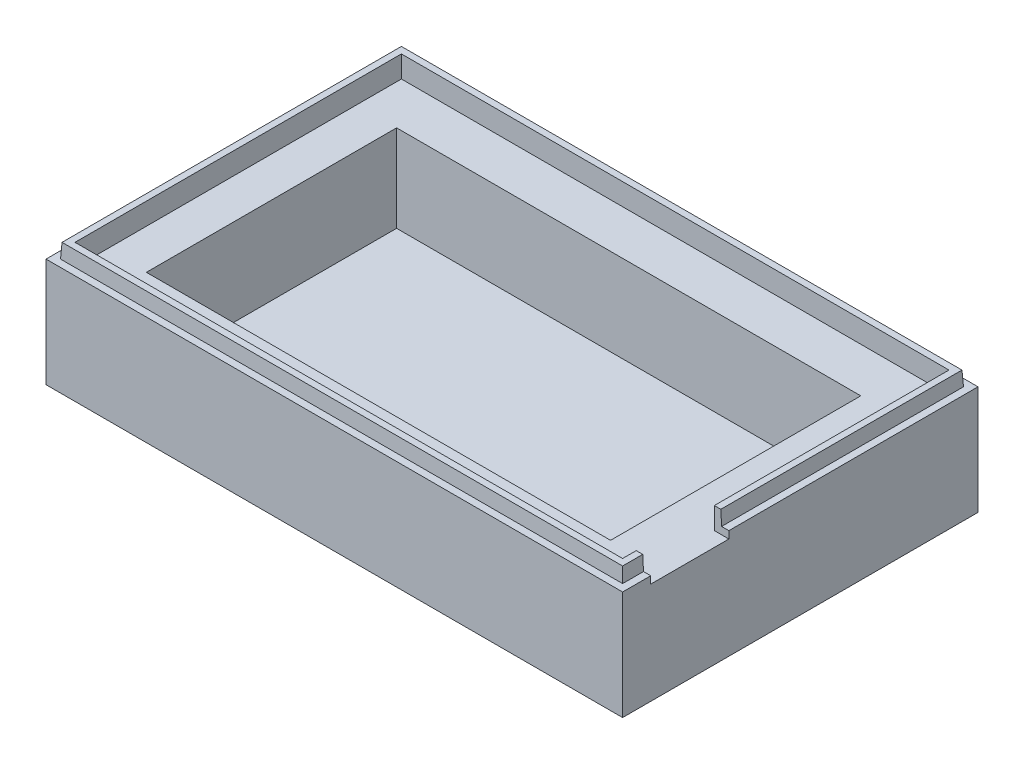
ISO-10303-21;
HEADER;
FILE_DESCRIPTION(('STEP AP214'),'2;1');
FILE_NAME('part.step','',(''),(''),'','','');
FILE_SCHEMA(('AUTOMOTIVE_DESIGN { 1 0 10303 214 1 1 1 1 }'));
ENDSEC;
DATA;
#1=APPLICATION_CONTEXT('core data for automotive mechanical design processes');
#2=APPLICATION_PROTOCOL_DEFINITION('international standard','automotive_design',2000,#1);
#3=PRODUCT_CONTEXT('',#1,'mechanical');
#4=PRODUCT('Part','Part','',(#3));
#5=PRODUCT_RELATED_PRODUCT_CATEGORY('part','',(#4));
#6=PRODUCT_DEFINITION_FORMATION('','',#4);
#7=PRODUCT_DEFINITION_CONTEXT('part definition',#1,'design');
#8=PRODUCT_DEFINITION('design','',#6,#7);
#9=PRODUCT_DEFINITION_SHAPE('','',#8);
#10=(LENGTH_UNIT() NAMED_UNIT(*) SI_UNIT(.MILLI.,.METRE.));
#11=(NAMED_UNIT(*) PLANE_ANGLE_UNIT() SI_UNIT($,.RADIAN.));
#12=(NAMED_UNIT(*) SI_UNIT($,.STERADIAN.) SOLID_ANGLE_UNIT());
#13=UNCERTAINTY_MEASURE_WITH_UNIT(LENGTH_MEASURE(1.E-05),#10,'distance_accuracy_value','');
#14=(GEOMETRIC_REPRESENTATION_CONTEXT(3) GLOBAL_UNCERTAINTY_ASSIGNED_CONTEXT((#13)) GLOBAL_UNIT_ASSIGNED_CONTEXT((#10,
#11,#12)) REPRESENTATION_CONTEXT('',''));
#15=CARTESIAN_POINT('',(0.,0.,0.));
#16=DIRECTION('',(0.,0.,1.));
#17=DIRECTION('',(1.,0.,0.));
#18=AXIS2_PLACEMENT_3D('',#15,#16,#17);
#19=CARTESIAN_POINT('',(0.,15.,0.));
#20=DIRECTION('',(0.,-1.,0.));
#21=DIRECTION('',(0.,0.,-1.));
#22=AXIS2_PLACEMENT_3D('',#19,#20,#21);
#23=PLANE('',#22);
#24=DIRECTION('',(0.,0.,-1.));
#25=VECTOR('',#24,1.);
#26=CARTESIAN_POINT('',(78.5,15.,0.));
#27=LINE('',#26,#25);
#28=CARTESIAN_POINT('',(78.5,15.,-14.65));
#29=VERTEX_POINT('',#28);
#30=CARTESIAN_POINT('',(78.5,15.,-48.));
#31=VERTEX_POINT('',#30);
#32=EDGE_CURVE('E322',#29,#31,#27,.T.);
#33=ORIENTED_EDGE('',*,*,#32,.F.);
#34=DIRECTION('',(1.,0.,0.));
#35=VECTOR('',#34,1.);
#36=CARTESIAN_POINT('',(-0.00100000000002876,15.,-14.65));
#37=LINE('',#36,#35);
#38=CARTESIAN_POINT('',(79.5,15.,-14.65));
#39=VERTEX_POINT('',#38);
#40=EDGE_CURVE('E380',#29,#39,#37,.T.);
#41=ORIENTED_EDGE('',*,*,#40,.T.);
#42=DIRECTION('',(0.,0.,-1.));
#43=VECTOR('',#42,1.);
#44=CARTESIAN_POINT('',(79.5,15.,0.));
#45=LINE('',#44,#43);
#46=CARTESIAN_POINT('',(79.5,15.,-49.));
#47=VERTEX_POINT('',#46);
#48=EDGE_CURVE('E423',#39,#47,#45,.T.);
#49=ORIENTED_EDGE('',*,*,#48,.T.);
#50=DIRECTION('',(-1.,0.,0.));
#51=VECTOR('',#50,1.);
#52=CARTESIAN_POINT('',(0.,15.,-49.));
#53=LINE('',#52,#51);
#54=CARTESIAN_POINT('',(0.,15.,-49.));
#55=VERTEX_POINT('',#54);
#56=EDGE_CURVE('E393',#47,#55,#53,.T.);
#57=ORIENTED_EDGE('',*,*,#56,.T.);
#58=DIRECTION('',(0.,0.,1.));
#59=VECTOR('',#58,1.);
#60=CARTESIAN_POINT('',(0.,15.,0.));
#61=LINE('',#60,#59);
#62=CARTESIAN_POINT('',(0.,15.,0.));
#63=VERTEX_POINT('',#62);
#64=EDGE_CURVE('E396',#55,#63,#61,.T.);
#65=ORIENTED_EDGE('',*,*,#64,.T.);
#66=DIRECTION('',(1.,0.,0.));
#67=VECTOR('',#66,1.);
#68=CARTESIAN_POINT('',(0.,15.,0.));
#69=LINE('',#68,#67);
#70=CARTESIAN_POINT('',(79.5,15.,0.));
#71=VERTEX_POINT('',#70);
#72=EDGE_CURVE('E419',#63,#71,#69,.T.);
#73=ORIENTED_EDGE('',*,*,#72,.T.);
#74=CARTESIAN_POINT('',(79.5,15.,-3.87999999999998));
#75=VERTEX_POINT('',#74);
#76=EDGE_CURVE('E407',#71,#75,#45,.T.);
#77=ORIENTED_EDGE('',*,*,#76,.T.);
#78=DIRECTION('',(1.,0.,0.));
#79=VECTOR('',#78,1.);
#80=CARTESIAN_POINT('',(-0.00100000000001488,15.,-3.87999999999993));
#81=LINE('',#80,#79);
#82=CARTESIAN_POINT('',(78.5,15.,-3.87999999999998));
#83=VERTEX_POINT('',#82);
#84=EDGE_CURVE('E377',#83,#75,#81,.T.);
#85=ORIENTED_EDGE('',*,*,#84,.F.);
#86=DIRECTION('',(0.,0.,-1.));
#87=VECTOR('',#86,1.);
#88=CARTESIAN_POINT('',(78.5,15.,0.));
#89=LINE('',#88,#87);
#90=CARTESIAN_POINT('',(78.5,15.,-1.));
#91=VERTEX_POINT('',#90);
#92=EDGE_CURVE('E297',#91,#83,#89,.T.);
#93=ORIENTED_EDGE('',*,*,#92,.F.);
#94=DIRECTION('',(1.,0.,0.));
#95=VECTOR('',#94,1.);
#96=CARTESIAN_POINT('',(0.,15.,-1.));
#97=LINE('',#96,#95);
#98=CARTESIAN_POINT('',(0.999999999999977,15.,-1.));
#99=VERTEX_POINT('',#98);
#100=EDGE_CURVE('E301',#99,#91,#97,.T.);
#101=ORIENTED_EDGE('',*,*,#100,.F.);
#102=DIRECTION('',(0.,0.,1.));
#103=VECTOR('',#102,1.);
#104=CARTESIAN_POINT('',(0.999999999999977,15.,0.));
#105=LINE('',#104,#103);
#106=CARTESIAN_POINT('',(0.999999999999972,15.,-48.));
#107=VERTEX_POINT('',#106);
#108=EDGE_CURVE('E143',#107,#99,#105,.T.);
#109=ORIENTED_EDGE('',*,*,#108,.F.);
#110=DIRECTION('',(-1.,0.,0.));
#111=VECTOR('',#110,1.);
#112=CARTESIAN_POINT('',(0.,15.,-48.));
#113=LINE('',#112,#111);
#114=EDGE_CURVE('E138',#31,#107,#113,.T.);
#115=ORIENTED_EDGE('',*,*,#114,.F.);
#116=EDGE_LOOP('',(#33,#41,#49,#57,#65,#73,#77,#85,#93,#101,#109,#115));
#117=FACE_BOUND('',#116,.T.);
#118=ADVANCED_FACE('F121',(#117),#23,.F.);
#119=CARTESIAN_POINT('',(77.5,14.,-47.));
#120=DIRECTION('',(1.,0.,0.));
#121=DIRECTION('',(0.,0.,-1.));
#122=AXIS2_PLACEMENT_3D('',#119,#120,#121);
#123=PLANE('',#122);
#124=DIRECTION('',(0.,0.,-1.));
#125=VECTOR('',#124,1.);
#126=CARTESIAN_POINT('',(77.5,14.,-47.));
#127=LINE('',#126,#125);
#128=CARTESIAN_POINT('',(77.5,14.,-14.65));
#129=VERTEX_POINT('',#128);
#130=CARTESIAN_POINT('',(77.5,14.,-47.));
#131=VERTEX_POINT('',#130);
#132=EDGE_CURVE('E276',#129,#131,#127,.T.);
#133=ORIENTED_EDGE('',*,*,#132,.F.);
#134=DIRECTION('',(0.,-1.,0.));
#135=VECTOR('',#134,1.);
#136=CARTESIAN_POINT('',(77.5,15.,-14.65));
#137=LINE('',#136,#135);
#138=CARTESIAN_POINT('',(77.5,17.,-14.65));
#139=VERTEX_POINT('',#138);
#140=EDGE_CURVE('E270',#139,#129,#137,.T.);
#141=ORIENTED_EDGE('',*,*,#140,.F.);
#142=DIRECTION('',(0.,0.,-1.));
#143=VECTOR('',#142,1.);
#144=CARTESIAN_POINT('',(77.5,17.,-47.));
#145=LINE('',#144,#143);
#146=CARTESIAN_POINT('',(77.5,17.,-47.));
#147=VERTEX_POINT('',#146);
#148=EDGE_CURVE('E275',#139,#147,#145,.T.);
#149=ORIENTED_EDGE('',*,*,#148,.T.);
#150=DIRECTION('',(0.,1.,0.));
#151=VECTOR('',#150,1.);
#152=CARTESIAN_POINT('',(77.5,14.,-47.));
#153=LINE('',#152,#151);
#154=EDGE_CURVE('E515',#131,#147,#153,.T.);
#155=ORIENTED_EDGE('',*,*,#154,.F.);
#156=EDGE_LOOP('',(#133,#141,#149,#155));
#157=FACE_BOUND('',#156,.T.);
#158=ADVANCED_FACE('F272',(#157),#123,.F.);
#159=CARTESIAN_POINT('',(0.,15.,0.));
#160=DIRECTION('',(1.,0.,0.));
#161=DIRECTION('',(0.,0.,-1.));
#162=AXIS2_PLACEMENT_3D('',#159,#160,#161);
#163=PLANE('',#162);
#164=DIRECTION('',(0.,0.,1.));
#165=VECTOR('',#164,1.);
#166=CARTESIAN_POINT('',(0.,0.,0.));
#167=LINE('',#166,#165);
#168=CARTESIAN_POINT('',(0.,0.,-49.));
#169=VERTEX_POINT('',#168);
#170=CARTESIAN_POINT('',(0.,0.,0.));
#171=VERTEX_POINT('',#170);
#172=EDGE_CURVE('E401',#169,#171,#167,.T.);
#173=ORIENTED_EDGE('',*,*,#172,.T.);
#174=DIRECTION('',(0.,-1.,0.));
#175=VECTOR('',#174,1.);
#176=CARTESIAN_POINT('',(0.,15.,0.));
#177=LINE('',#176,#175);
#178=EDGE_CURVE('E130',#63,#171,#177,.T.);
#179=ORIENTED_EDGE('',*,*,#178,.F.);
#180=ORIENTED_EDGE('',*,*,#64,.F.);
#181=DIRECTION('',(0.,-1.,0.));
#182=VECTOR('',#181,1.);
#183=CARTESIAN_POINT('',(0.,15.,-49.));
#184=LINE('',#183,#182);
#185=EDGE_CURVE('E390',#55,#169,#184,.T.);
#186=ORIENTED_EDGE('',*,*,#185,.T.);
#187=EDGE_LOOP('',(#173,#179,#180,#186));
#188=FACE_BOUND('',#187,.T.);
#189=ADVANCED_FACE('F123',(#188),#163,.F.);
#190=CARTESIAN_POINT('',(0.,15.,0.));
#191=DIRECTION('',(0.,0.,-1.));
#192=DIRECTION('',(-1.,0.,0.));
#193=AXIS2_PLACEMENT_3D('',#190,#191,#192);
#194=PLANE('',#193);
#195=DIRECTION('',(1.,0.,0.));
#196=VECTOR('',#195,1.);
#197=CARTESIAN_POINT('',(0.,0.,0.));
#198=LINE('',#197,#196);
#199=CARTESIAN_POINT('',(79.5,0.,0.));
#200=VERTEX_POINT('',#199);
#201=EDGE_CURVE('E399',#171,#200,#198,.T.);
#202=ORIENTED_EDGE('',*,*,#201,.T.);
#203=DIRECTION('',(0.,-1.,0.));
#204=VECTOR('',#203,1.);
#205=CARTESIAN_POINT('',(79.5,15.,0.));
#206=LINE('',#205,#204);
#207=EDGE_CURVE('E384',#71,#200,#206,.T.);
#208=ORIENTED_EDGE('',*,*,#207,.F.);
#209=ORIENTED_EDGE('',*,*,#72,.F.);
#210=ORIENTED_EDGE('',*,*,#178,.T.);
#211=EDGE_LOOP('',(#202,#208,#209,#210));
#212=FACE_BOUND('',#211,.T.);
#213=ADVANCED_FACE('F481',(#212),#194,.F.);
#214=CARTESIAN_POINT('',(79.5,15.,0.));
#215=DIRECTION('',(-1.,0.,0.));
#216=DIRECTION('',(0.,0.,1.));
#217=AXIS2_PLACEMENT_3D('',#214,#215,#216);
#218=PLANE('',#217);
#219=ORIENTED_EDGE('',*,*,#48,.F.);
#220=DIRECTION('',(0.,1.,0.));
#221=VECTOR('',#220,1.);
#222=CARTESIAN_POINT('',(79.5,15.,-14.65));
#223=LINE('',#222,#221);
#224=CARTESIAN_POINT('',(79.5,14.,-14.65));
#225=VERTEX_POINT('',#224);
#226=EDGE_CURVE('E358',#225,#39,#223,.T.);
#227=ORIENTED_EDGE('',*,*,#226,.F.);
#228=DIRECTION('',(0.,0.,-1.));
#229=VECTOR('',#228,1.);
#230=CARTESIAN_POINT('',(79.5,14.,-3.87999999999998));
#231=LINE('',#230,#229);
#232=CARTESIAN_POINT('',(79.5,14.,-3.87999999999998));
#233=VERTEX_POINT('',#232);
#234=EDGE_CURVE('E362',#233,#225,#231,.T.);
#235=ORIENTED_EDGE('',*,*,#234,.F.);
#236=DIRECTION('',(0.,-1.,0.));
#237=VECTOR('',#236,1.);
#238=CARTESIAN_POINT('',(79.5,15.,-3.87999999999998));
#239=LINE('',#238,#237);
#240=EDGE_CURVE('E278',#75,#233,#239,.T.);
#241=ORIENTED_EDGE('',*,*,#240,.F.);
#242=ORIENTED_EDGE('',*,*,#76,.F.);
#243=ORIENTED_EDGE('',*,*,#207,.T.);
#244=DIRECTION('',(0.,0.,-1.));
#245=VECTOR('',#244,1.);
#246=CARTESIAN_POINT('',(79.5,0.,0.));
#247=LINE('',#246,#245);
#248=CARTESIAN_POINT('',(79.5,0.,-49.));
#249=VERTEX_POINT('',#248);
#250=EDGE_CURVE('E397',#200,#249,#247,.T.);
#251=ORIENTED_EDGE('',*,*,#250,.T.);
#252=DIRECTION('',(0.,-1.,0.));
#253=VECTOR('',#252,1.);
#254=CARTESIAN_POINT('',(79.5,15.,-49.));
#255=LINE('',#254,#253);
#256=EDGE_CURVE('E387',#47,#249,#255,.T.);
#257=ORIENTED_EDGE('',*,*,#256,.F.);
#258=EDGE_LOOP('',(#219,#227,#235,#241,#242,#243,#251,#257));
#259=FACE_BOUND('',#258,.T.);
#260=ADVANCED_FACE('F431',(#259),#218,.F.);
#261=CARTESIAN_POINT('',(0.,15.,-49.));
#262=DIRECTION('',(0.,0.,1.));
#263=DIRECTION('',(1.,0.,0.));
#264=AXIS2_PLACEMENT_3D('',#261,#262,#263);
#265=PLANE('',#264);
#266=DIRECTION('',(-1.,0.,0.));
#267=VECTOR('',#266,1.);
#268=CARTESIAN_POINT('',(0.,0.,-49.));
#269=LINE('',#268,#267);
#270=EDGE_CURVE('E394',#249,#169,#269,.T.);
#271=ORIENTED_EDGE('',*,*,#270,.T.);
#272=ORIENTED_EDGE('',*,*,#185,.F.);
#273=ORIENTED_EDGE('',*,*,#56,.F.);
#274=ORIENTED_EDGE('',*,*,#256,.T.);
#275=EDGE_LOOP('',(#271,#272,#273,#274));
#276=FACE_BOUND('',#275,.T.);
#277=ADVANCED_FACE('F475',(#276),#265,.F.);
#278=CARTESIAN_POINT('',(0.,0.,0.));
#279=DIRECTION('',(0.,-1.,0.));
#280=DIRECTION('',(0.,0.,-1.));
#281=AXIS2_PLACEMENT_3D('',#278,#279,#280);
#282=PLANE('',#281);
#283=ORIENTED_EDGE('',*,*,#172,.F.);
#284=ORIENTED_EDGE('',*,*,#270,.F.);
#285=ORIENTED_EDGE('',*,*,#250,.F.);
#286=ORIENTED_EDGE('',*,*,#201,.F.);
#287=EDGE_LOOP('',(#283,#284,#285,#286));
#288=FACE_BOUND('',#287,.T.);
#289=ADVANCED_FACE('F471',(#288),#282,.T.);
#290=CARTESIAN_POINT('',(0.,14.,0.));
#291=DIRECTION('',(0.,1.,0.));
#292=DIRECTION('',(0.,0.,1.));
#293=AXIS2_PLACEMENT_3D('',#290,#291,#292);
#294=PLANE('',#293);
#295=DIRECTION('',(0.,0.,1.));
#296=VECTOR('',#295,1.);
#297=CARTESIAN_POINT('',(1.99999999999997,14.,-47.));
#298=LINE('',#297,#296);
#299=CARTESIAN_POINT('',(1.99999999999997,14.,-47.));
#300=VERTEX_POINT('',#299);
#301=CARTESIAN_POINT('',(1.99999999999998,14.,-2.));
#302=VERTEX_POINT('',#301);
#303=EDGE_CURVE('E501',#300,#302,#298,.T.);
#304=ORIENTED_EDGE('',*,*,#303,.T.);
#305=DIRECTION('',(1.,0.,0.));
#306=VECTOR('',#305,1.);
#307=CARTESIAN_POINT('',(1.99999999999998,14.,-2.));
#308=LINE('',#307,#306);
#309=CARTESIAN_POINT('',(77.5,14.,-2.));
#310=VERTEX_POINT('',#309);
#311=EDGE_CURVE('E503',#302,#310,#308,.T.);
#312=ORIENTED_EDGE('',*,*,#311,.T.);
#313=CARTESIAN_POINT('',(77.5,14.,-3.87999999999999));
#314=VERTEX_POINT('',#313);
#315=EDGE_CURVE('E500',#310,#314,#127,.T.);
#316=ORIENTED_EDGE('',*,*,#315,.T.);
#317=DIRECTION('',(1.,0.,0.));
#318=VECTOR('',#317,1.);
#319=CARTESIAN_POINT('',(-0.00100000000001488,14.,-3.87999999999993));
#320=LINE('',#319,#318);
#321=EDGE_CURVE('E379',#314,#233,#320,.T.);
#322=ORIENTED_EDGE('',*,*,#321,.T.);
#323=ORIENTED_EDGE('',*,*,#234,.T.);
#324=DIRECTION('',(1.,0.,0.));
#325=VECTOR('',#324,1.);
#326=CARTESIAN_POINT('',(-0.00100000000002876,14.,-14.65));
#327=LINE('',#326,#325);
#328=EDGE_CURVE('E361',#129,#225,#327,.T.);
#329=ORIENTED_EDGE('',*,*,#328,.F.);
#330=ORIENTED_EDGE('',*,*,#132,.T.);
#331=DIRECTION('',(-1.,0.,0.));
#332=VECTOR('',#331,1.);
#333=CARTESIAN_POINT('',(1.99999999999997,14.,-47.));
#334=LINE('',#333,#332);
#335=EDGE_CURVE('E508',#131,#300,#334,.T.);
#336=ORIENTED_EDGE('',*,*,#335,.T.);
#337=EDGE_LOOP('',(#304,#312,#316,#322,#323,#329,#330,#336));
#338=FACE_BOUND('',#337,.T.);
#339=DIRECTION('',(0.,0.,-1.));
#340=VECTOR('',#339,1.);
#341=CARTESIAN_POINT('',(7.49999999999999,14.,-40.84));
#342=LINE('',#341,#340);
#343=CARTESIAN_POINT('',(7.5,14.,-6.34));
#344=VERTEX_POINT('',#343);
#345=CARTESIAN_POINT('',(7.49999999999999,14.,-40.84));
#346=VERTEX_POINT('',#345);
#347=EDGE_CURVE('E525',#344,#346,#342,.T.);
#348=ORIENTED_EDGE('',*,*,#347,.T.);
#349=DIRECTION('',(-1.,0.,0.));
#350=VECTOR('',#349,1.);
#351=CARTESIAN_POINT('',(7.49999999999999,14.,-40.84));
#352=LINE('',#351,#350);
#353=CARTESIAN_POINT('',(71.5,14.,-40.84));
#354=VERTEX_POINT('',#353);
#355=EDGE_CURVE('E522',#354,#346,#352,.T.);
#356=ORIENTED_EDGE('',*,*,#355,.F.);
#357=DIRECTION('',(0.,0.,-1.));
#358=VECTOR('',#357,1.);
#359=CARTESIAN_POINT('',(71.5,14.,-40.84));
#360=LINE('',#359,#358);
#361=CARTESIAN_POINT('',(71.5,14.,-6.34));
#362=VERTEX_POINT('',#361);
#363=EDGE_CURVE('E514',#362,#354,#360,.T.);
#364=ORIENTED_EDGE('',*,*,#363,.F.);
#365=DIRECTION('',(-1.,0.,0.));
#366=VECTOR('',#365,1.);
#367=CARTESIAN_POINT('',(7.5,14.,-6.34));
#368=LINE('',#367,#366);
#369=EDGE_CURVE('E13',#362,#344,#368,.T.);
#370=ORIENTED_EDGE('',*,*,#369,.T.);
#371=EDGE_LOOP('',(#348,#356,#364,#370));
#372=FACE_BOUND('',#371,.T.);
#373=ADVANCED_FACE('F474',(#338,#372),#294,.T.);
#374=CARTESIAN_POINT('',(1.99999999999997,14.,-47.));
#375=DIRECTION('',(-1.,0.,0.));
#376=DIRECTION('',(0.,0.,1.));
#377=AXIS2_PLACEMENT_3D('',#374,#375,#376);
#378=PLANE('',#377);
#379=DIRECTION('',(0.,1.,0.));
#380=VECTOR('',#379,1.);
#381=CARTESIAN_POINT('',(1.99999999999997,14.,-47.));
#382=LINE('',#381,#380);
#383=CARTESIAN_POINT('',(1.99999999999997,17.,-47.));
#384=VERTEX_POINT('',#383);
#385=EDGE_CURVE('E512',#300,#384,#382,.T.);
#386=ORIENTED_EDGE('',*,*,#385,.T.);
#387=DIRECTION('',(0.,0.,1.));
#388=VECTOR('',#387,1.);
#389=CARTESIAN_POINT('',(1.99999999999997,17.,-47.));
#390=LINE('',#389,#388);
#391=CARTESIAN_POINT('',(1.99999999999998,17.,-2.));
#392=VERTEX_POINT('',#391);
#393=EDGE_CURVE('E309',#384,#392,#390,.T.);
#394=ORIENTED_EDGE('',*,*,#393,.T.);
#395=DIRECTION('',(0.,1.,0.));
#396=VECTOR('',#395,1.);
#397=CARTESIAN_POINT('',(1.99999999999998,14.,-2.));
#398=LINE('',#397,#396);
#399=EDGE_CURVE('E511',#302,#392,#398,.T.);
#400=ORIENTED_EDGE('',*,*,#399,.F.);
#401=ORIENTED_EDGE('',*,*,#303,.F.);
#402=EDGE_LOOP('',(#386,#394,#400,#401));
#403=FACE_BOUND('',#402,.T.);
#404=ADVANCED_FACE('F572',(#403),#378,.F.);
#405=CARTESIAN_POINT('',(1.99999999999997,14.,-47.));
#406=DIRECTION('',(0.,0.,-1.));
#407=DIRECTION('',(-1.,0.,0.));
#408=AXIS2_PLACEMENT_3D('',#405,#406,#407);
#409=PLANE('',#408);
#410=ORIENTED_EDGE('',*,*,#154,.T.);
#411=DIRECTION('',(-1.,0.,0.));
#412=VECTOR('',#411,1.);
#413=CARTESIAN_POINT('',(1.99999999999997,17.,-47.));
#414=LINE('',#413,#412);
#415=EDGE_CURVE('E296',#147,#384,#414,.T.);
#416=ORIENTED_EDGE('',*,*,#415,.T.);
#417=ORIENTED_EDGE('',*,*,#385,.F.);
#418=ORIENTED_EDGE('',*,*,#335,.F.);
#419=EDGE_LOOP('',(#410,#416,#417,#418));
#420=FACE_BOUND('',#419,.T.);
#421=ADVANCED_FACE('F642',(#420),#409,.F.);
#422=DIRECTION('',(0.,1.,0.));
#423=VECTOR('',#422,1.);
#424=CARTESIAN_POINT('',(77.5,14.,-2.));
#425=LINE('',#424,#423);
#426=CARTESIAN_POINT('',(77.5,17.,-2.));
#427=VERTEX_POINT('',#426);
#428=EDGE_CURVE('E517',#310,#427,#425,.T.);
#429=ORIENTED_EDGE('',*,*,#428,.T.);
#430=CARTESIAN_POINT('',(77.5,17.,-3.87999999999998));
#431=VERTEX_POINT('',#430);
#432=EDGE_CURVE('E299',#427,#431,#145,.T.);
#433=ORIENTED_EDGE('',*,*,#432,.T.);
#434=DIRECTION('',(0.,1.,0.));
#435=VECTOR('',#434,1.);
#436=CARTESIAN_POINT('',(77.5,15.,-3.87999999999998));
#437=LINE('',#436,#435);
#438=EDGE_CURVE('E279',#314,#431,#437,.T.);
#439=ORIENTED_EDGE('',*,*,#438,.F.);
#440=ORIENTED_EDGE('',*,*,#315,.F.);
#441=EDGE_LOOP('',(#429,#433,#439,#440));
#442=FACE_BOUND('',#441,.T.);
#443=ADVANCED_FACE('F466',(#442),#123,.F.);
#444=CARTESIAN_POINT('',(1.99999999999998,14.,-2.));
#445=DIRECTION('',(0.,0.,1.));
#446=DIRECTION('',(1.,0.,0.));
#447=AXIS2_PLACEMENT_3D('',#444,#445,#446);
#448=PLANE('',#447);
#449=ORIENTED_EDGE('',*,*,#399,.T.);
#450=DIRECTION('',(1.,0.,0.));
#451=VECTOR('',#450,1.);
#452=CARTESIAN_POINT('',(1.99999999999998,17.,-2.));
#453=LINE('',#452,#451);
#454=EDGE_CURVE('E304',#392,#427,#453,.T.);
#455=ORIENTED_EDGE('',*,*,#454,.T.);
#456=ORIENTED_EDGE('',*,*,#428,.F.);
#457=ORIENTED_EDGE('',*,*,#311,.F.);
#458=EDGE_LOOP('',(#449,#455,#456,#457));
#459=FACE_BOUND('',#458,.T.);
#460=ADVANCED_FACE('F562',(#459),#448,.F.);
#461=CARTESIAN_POINT('',(0.,2.,0.));
#462=DIRECTION('',(0.,1.,0.));
#463=DIRECTION('',(0.,0.,1.));
#464=AXIS2_PLACEMENT_3D('',#461,#462,#463);
#465=PLANE('',#464);
#466=DIRECTION('',(0.,0.,1.));
#467=VECTOR('',#466,1.);
#468=CARTESIAN_POINT('',(7.49999999999999,2.,-40.84));
#469=LINE('',#468,#467);
#470=CARTESIAN_POINT('',(7.49999999999999,2.,-40.84));
#471=VERTEX_POINT('',#470);
#472=CARTESIAN_POINT('',(7.5,2.,-6.34));
#473=VERTEX_POINT('',#472);
#474=EDGE_CURVE('E527',#471,#473,#469,.T.);
#475=ORIENTED_EDGE('',*,*,#474,.T.);
#476=DIRECTION('',(1.,0.,0.));
#477=VECTOR('',#476,1.);
#478=CARTESIAN_POINT('',(7.5,2.,-6.34));
#479=LINE('',#478,#477);
#480=CARTESIAN_POINT('',(71.5,2.,-6.34));
#481=VERTEX_POINT('',#480);
#482=EDGE_CURVE('E530',#473,#481,#479,.T.);
#483=ORIENTED_EDGE('',*,*,#482,.T.);
#484=DIRECTION('',(0.,0.,1.));
#485=VECTOR('',#484,1.);
#486=CARTESIAN_POINT('',(71.5,2.,-40.84));
#487=LINE('',#486,#485);
#488=CARTESIAN_POINT('',(71.5,2.,-40.84));
#489=VERTEX_POINT('',#488);
#490=EDGE_CURVE('E533',#489,#481,#487,.T.);
#491=ORIENTED_EDGE('',*,*,#490,.F.);
#492=DIRECTION('',(1.,0.,0.));
#493=VECTOR('',#492,1.);
#494=CARTESIAN_POINT('',(7.49999999999999,2.,-40.84));
#495=LINE('',#494,#493);
#496=EDGE_CURVE('E535',#471,#489,#495,.T.);
#497=ORIENTED_EDGE('',*,*,#496,.F.);
#498=EDGE_LOOP('',(#475,#483,#491,#497));
#499=FACE_BOUND('',#498,.T.);
#500=ADVANCED_FACE('F560',(#499),#465,.T.);
#501=CARTESIAN_POINT('',(7.5,2.,-6.34));
#502=DIRECTION('',(0.,0.,1.));
#503=DIRECTION('',(1.,0.,0.));
#504=AXIS2_PLACEMENT_3D('',#501,#502,#503);
#505=PLANE('',#504);
#506=ORIENTED_EDGE('',*,*,#369,.F.);
#507=DIRECTION('',(0.,1.,0.));
#508=VECTOR('',#507,1.);
#509=CARTESIAN_POINT('',(71.5,2.,-6.34));
#510=LINE('',#509,#508);
#511=EDGE_CURVE('E541',#481,#362,#510,.T.);
#512=ORIENTED_EDGE('',*,*,#511,.F.);
#513=ORIENTED_EDGE('',*,*,#482,.F.);
#514=DIRECTION('',(0.,1.,0.));
#515=VECTOR('',#514,1.);
#516=CARTESIAN_POINT('',(7.5,2.,-6.34));
#517=LINE('',#516,#515);
#518=EDGE_CURVE('E420',#473,#344,#517,.T.);
#519=ORIENTED_EDGE('',*,*,#518,.T.);
#520=EDGE_LOOP('',(#506,#512,#513,#519));
#521=FACE_BOUND('',#520,.T.);
#522=ADVANCED_FACE('F549',(#521),#505,.F.);
#523=CARTESIAN_POINT('',(71.5,2.,-40.84));
#524=DIRECTION('',(-1.,0.,0.));
#525=DIRECTION('',(0.,0.,1.));
#526=AXIS2_PLACEMENT_3D('',#523,#524,#525);
#527=PLANE('',#526);
#528=ORIENTED_EDGE('',*,*,#511,.T.);
#529=ORIENTED_EDGE('',*,*,#363,.T.);
#530=DIRECTION('',(0.,1.,0.));
#531=VECTOR('',#530,1.);
#532=CARTESIAN_POINT('',(71.5,2.,-40.84));
#533=LINE('',#532,#531);
#534=EDGE_CURVE('E539',#489,#354,#533,.T.);
#535=ORIENTED_EDGE('',*,*,#534,.F.);
#536=ORIENTED_EDGE('',*,*,#490,.T.);
#537=EDGE_LOOP('',(#528,#529,#535,#536));
#538=FACE_BOUND('',#537,.T.);
#539=ADVANCED_FACE('F558',(#538),#527,.T.);
#540=CARTESIAN_POINT('',(7.49999999999999,2.,-40.84));
#541=DIRECTION('',(0.,0.,1.));
#542=DIRECTION('',(1.,0.,0.));
#543=AXIS2_PLACEMENT_3D('',#540,#541,#542);
#544=PLANE('',#543);
#545=ORIENTED_EDGE('',*,*,#534,.T.);
#546=ORIENTED_EDGE('',*,*,#355,.T.);
#547=DIRECTION('',(0.,1.,0.));
#548=VECTOR('',#547,1.);
#549=CARTESIAN_POINT('',(7.49999999999999,2.,-40.84));
#550=LINE('',#549,#548);
#551=EDGE_CURVE('E404',#471,#346,#550,.T.);
#552=ORIENTED_EDGE('',*,*,#551,.F.);
#553=ORIENTED_EDGE('',*,*,#496,.T.);
#554=EDGE_LOOP('',(#545,#546,#552,#553));
#555=FACE_BOUND('',#554,.T.);
#556=ADVANCED_FACE('F554',(#555),#544,.T.);
#557=CARTESIAN_POINT('',(7.49999999999999,2.,-40.84));
#558=DIRECTION('',(-1.,0.,0.));
#559=DIRECTION('',(0.,0.,1.));
#560=AXIS2_PLACEMENT_3D('',#557,#558,#559);
#561=PLANE('',#560);
#562=ORIENTED_EDGE('',*,*,#347,.F.);
#563=ORIENTED_EDGE('',*,*,#518,.F.);
#564=ORIENTED_EDGE('',*,*,#474,.F.);
#565=ORIENTED_EDGE('',*,*,#551,.T.);
#566=EDGE_LOOP('',(#562,#563,#564,#565));
#567=FACE_BOUND('',#566,.T.);
#568=ADVANCED_FACE('F469',(#567),#561,.F.);
#569=CARTESIAN_POINT('',(-0.00100000000002876,15.,-14.65));
#570=DIRECTION('',(0.,0.,-1.));
#571=DIRECTION('',(-1.,0.,0.));
#572=AXIS2_PLACEMENT_3D('',#569,#570,#571);
#573=PLANE('',#572);
#574=ORIENTED_EDGE('',*,*,#140,.T.);
#575=ORIENTED_EDGE('',*,*,#328,.T.);
#576=ORIENTED_EDGE('',*,*,#226,.T.);
#577=ORIENTED_EDGE('',*,*,#40,.F.);
#578=DIRECTION('',(-0.0523359562429438,0.998629534754574,0.));
#579=VECTOR('',#578,1.);
#580=CARTESIAN_POINT('',(78.5,15.,-14.65));
#581=LINE('',#580,#579);
#582=CARTESIAN_POINT('',(78.3951844414339,17.,-14.65));
#583=VERTEX_POINT('',#582);
#584=EDGE_CURVE('E286',#583,#29,#581,.F.);
#585=ORIENTED_EDGE('',*,*,#584,.F.);
#586=DIRECTION('',(1.,0.,0.));
#587=VECTOR('',#586,1.);
#588=CARTESIAN_POINT('',(-0.00100000000002876,17.,-14.65));
#589=LINE('',#588,#587);
#590=EDGE_CURVE('E282',#139,#583,#589,.T.);
#591=ORIENTED_EDGE('',*,*,#590,.F.);
#592=EDGE_LOOP('',(#574,#575,#576,#577,#585,#591));
#593=FACE_BOUND('',#592,.T.);
#594=ADVANCED_FACE('F283',(#593),#573,.F.);
#595=CARTESIAN_POINT('',(-0.00100000000001488,15.,-3.87999999999993));
#596=DIRECTION('',(0.,0.,1.));
#597=DIRECTION('',(1.,0.,0.));
#598=AXIS2_PLACEMENT_3D('',#595,#596,#597);
#599=PLANE('',#598);
#600=ORIENTED_EDGE('',*,*,#438,.T.);
#601=DIRECTION('',(1.,0.,0.));
#602=VECTOR('',#601,1.);
#603=CARTESIAN_POINT('',(-0.00100000000001488,17.,-3.87999999999993));
#604=LINE('',#603,#602);
#605=CARTESIAN_POINT('',(78.3951844414339,17.,-3.87999999999998));
#606=VERTEX_POINT('',#605);
#607=EDGE_CURVE('E289',#431,#606,#604,.T.);
#608=ORIENTED_EDGE('',*,*,#607,.T.);
#609=DIRECTION('',(-0.0523359562429438,0.998629534754574,0.));
#610=VECTOR('',#609,1.);
#611=CARTESIAN_POINT('',(78.5,15.,-3.87999999999998));
#612=LINE('',#611,#610);
#613=EDGE_CURVE('E336',#606,#83,#612,.F.);
#614=ORIENTED_EDGE('',*,*,#613,.T.);
#615=ORIENTED_EDGE('',*,*,#84,.T.);
#616=ORIENTED_EDGE('',*,*,#240,.T.);
#617=ORIENTED_EDGE('',*,*,#321,.F.);
#618=EDGE_LOOP('',(#600,#608,#614,#615,#616,#617));
#619=FACE_BOUND('',#618,.T.);
#620=ADVANCED_FACE('F435',(#619),#599,.F.);
#621=CARTESIAN_POINT('',(0.,15.,-1.));
#622=DIRECTION('',(0.,0.0523359562429438,0.998629534754574));
#623=DIRECTION('',(0.,-0.998629534754574,0.0523359562429438));
#624=AXIS2_PLACEMENT_3D('',#621,#622,#623);
#625=PLANE('',#624);
#626=ORIENTED_EDGE('',*,*,#100,.T.);
#627=DIRECTION('',(0.0522644276887139,-0.997264688634237,0.0522644276887139));
#628=VECTOR('',#627,1.);
#629=CARTESIAN_POINT('',(78.5027315704016,14.9478785317944,-0.997268429598371));
#630=LINE('',#629,#628);
#631=CARTESIAN_POINT('',(78.3951844414339,17.,-1.10481555856608));
#632=VERTEX_POINT('',#631);
#633=EDGE_CURVE('E328',#632,#91,#630,.T.);
#634=ORIENTED_EDGE('',*,*,#633,.F.);
#635=DIRECTION('',(-1.,0.,0.));
#636=VECTOR('',#635,1.);
#637=CARTESIAN_POINT('',(0.,17.,-1.10481555856608));
#638=LINE('',#637,#636);
#639=CARTESIAN_POINT('',(1.10481555856606,17.,-1.10481555856608));
#640=VERTEX_POINT('',#639);
#641=EDGE_CURVE('E354',#640,#632,#638,.F.);
#642=ORIENTED_EDGE('',*,*,#641,.F.);
#643=DIRECTION('',(-0.0522644276887139,-0.997264688634237,0.0522644276887139));
#644=VECTOR('',#643,1.);
#645=CARTESIAN_POINT('',(0.997268429598349,14.9478785317944,-0.997268429598371));
#646=LINE('',#645,#644);
#647=EDGE_CURVE('E346',#640,#99,#646,.T.);
#648=ORIENTED_EDGE('',*,*,#647,.T.);
#649=EDGE_LOOP('',(#626,#634,#642,#648));
#650=FACE_BOUND('',#649,.T.);
#651=ADVANCED_FACE('F449',(#650),#625,.T.);
#652=CARTESIAN_POINT('',(78.5,15.,0.));
#653=DIRECTION('',(0.998629534754574,0.0523359562429438,0.));
#654=DIRECTION('',(-0.0523359562429438,0.998629534754574,0.));
#655=AXIS2_PLACEMENT_3D('',#652,#653,#654);
#656=PLANE('',#655);
#657=ORIENTED_EDGE('',*,*,#92,.T.);
#658=ORIENTED_EDGE('',*,*,#613,.F.);
#659=DIRECTION('',(0.,0.,1.));
#660=VECTOR('',#659,1.);
#661=CARTESIAN_POINT('',(78.3951844414339,17.,0.));
#662=LINE('',#661,#660);
#663=EDGE_CURVE('E356',#632,#606,#662,.F.);
#664=ORIENTED_EDGE('',*,*,#663,.F.);
#665=ORIENTED_EDGE('',*,*,#633,.T.);
#666=EDGE_LOOP('',(#657,#658,#664,#665));
#667=FACE_BOUND('',#666,.T.);
#668=ADVANCED_FACE('F439',(#667),#656,.T.);
#669=CARTESIAN_POINT('',(78.5,15.,0.));
#670=DIRECTION('',(0.998629534754574,0.0523359562429438,0.));
#671=DIRECTION('',(-0.0523359562429438,0.998629534754574,0.));
#672=AXIS2_PLACEMENT_3D('',#669,#670,#671);
#673=PLANE('',#672);
#674=ORIENTED_EDGE('',*,*,#32,.T.);
#675=DIRECTION('',(0.0522644276887139,-0.997264688634237,-0.0522644276887139));
#676=VECTOR('',#675,1.);
#677=CARTESIAN_POINT('',(78.2855717234721,19.0915352541421,-47.7855717234721));
#678=LINE('',#677,#676);
#679=CARTESIAN_POINT('',(78.3951844414339,17.,-47.8951844414339));
#680=VERTEX_POINT('',#679);
#681=EDGE_CURVE('E337',#680,#31,#678,.T.);
#682=ORIENTED_EDGE('',*,*,#681,.F.);
#683=DIRECTION('',(0.,0.,1.));
#684=VECTOR('',#683,1.);
#685=CARTESIAN_POINT('',(78.3951844414339,17.,0.));
#686=LINE('',#685,#684);
#687=EDGE_CURVE('E320',#583,#680,#686,.F.);
#688=ORIENTED_EDGE('',*,*,#687,.F.);
#689=ORIENTED_EDGE('',*,*,#584,.T.);
#690=EDGE_LOOP('',(#674,#682,#688,#689));
#691=FACE_BOUND('',#690,.T.);
#692=ADVANCED_FACE('F452',(#691),#673,.T.);
#693=CARTESIAN_POINT('',(0.,15.,-48.));
#694=DIRECTION('',(0.,0.0523359562429438,-0.998629534754574));
#695=DIRECTION('',(0.,0.998629534754574,0.0523359562429438));
#696=AXIS2_PLACEMENT_3D('',#693,#694,#695);
#697=PLANE('',#696);
#698=ORIENTED_EDGE('',*,*,#114,.T.);
#699=DIRECTION('',(-0.0522644276887139,-0.997264688634237,-0.0522644276887139));
#700=VECTOR('',#699,1.);
#701=CARTESIAN_POINT('',(1.13111537927815,17.5018304738703,-47.8688846207218));
#702=LINE('',#701,#700);
#703=CARTESIAN_POINT('',(1.10481555856605,17.,-47.8951844414339));
#704=VERTEX_POINT('',#703);
#705=EDGE_CURVE('E340',#704,#107,#702,.T.);
#706=ORIENTED_EDGE('',*,*,#705,.F.);
#707=DIRECTION('',(1.,0.,0.));
#708=VECTOR('',#707,1.);
#709=CARTESIAN_POINT('',(0.,17.,-47.8951844414339));
#710=LINE('',#709,#708);
#711=EDGE_CURVE('E350',#680,#704,#710,.F.);
#712=ORIENTED_EDGE('',*,*,#711,.F.);
#713=ORIENTED_EDGE('',*,*,#681,.T.);
#714=EDGE_LOOP('',(#698,#706,#712,#713));
#715=FACE_BOUND('',#714,.T.);
#716=ADVANCED_FACE('F450',(#715),#697,.T.);
#717=CARTESIAN_POINT('',(0.999999999999977,15.,0.));
#718=DIRECTION('',(-0.998629534754574,0.0523359562429438,0.));
#719=DIRECTION('',(-0.0523359562429438,-0.998629534754574,0.));
#720=AXIS2_PLACEMENT_3D('',#717,#718,#719);
#721=PLANE('',#720);
#722=ORIENTED_EDGE('',*,*,#108,.T.);
#723=ORIENTED_EDGE('',*,*,#647,.F.);
#724=DIRECTION('',(0.,0.,-1.));
#725=VECTOR('',#724,1.);
#726=CARTESIAN_POINT('',(1.10481555856606,17.,0.));
#727=LINE('',#726,#725);
#728=EDGE_CURVE('E352',#704,#640,#727,.F.);
#729=ORIENTED_EDGE('',*,*,#728,.F.);
#730=ORIENTED_EDGE('',*,*,#705,.T.);
#731=EDGE_LOOP('',(#722,#723,#729,#730));
#732=FACE_BOUND('',#731,.T.);
#733=ADVANCED_FACE('F445',(#732),#721,.T.);
#734=CARTESIAN_POINT('',(0.,17.,0.));
#735=DIRECTION('',(0.,-1.,0.));
#736=DIRECTION('',(0.,0.,-1.));
#737=AXIS2_PLACEMENT_3D('',#734,#735,#736);
#738=PLANE('',#737);
#739=ORIENTED_EDGE('',*,*,#641,.T.);
#740=ORIENTED_EDGE('',*,*,#663,.T.);
#741=ORIENTED_EDGE('',*,*,#607,.F.);
#742=ORIENTED_EDGE('',*,*,#432,.F.);
#743=ORIENTED_EDGE('',*,*,#454,.F.);
#744=ORIENTED_EDGE('',*,*,#393,.F.);
#745=ORIENTED_EDGE('',*,*,#415,.F.);
#746=ORIENTED_EDGE('',*,*,#148,.F.);
#747=ORIENTED_EDGE('',*,*,#590,.T.);
#748=ORIENTED_EDGE('',*,*,#687,.T.);
#749=ORIENTED_EDGE('',*,*,#711,.T.);
#750=ORIENTED_EDGE('',*,*,#728,.T.);
#751=EDGE_LOOP('',(#739,#740,#741,#742,#743,#744,#745,#746,#747,#748,#749,#750));
#752=FACE_BOUND('',#751,.T.);
#753=ADVANCED_FACE('F293',(#752),#738,.F.);
#754=CLOSED_SHELL('',(#118,#158,#189,#213,#260,#277,#289,#373,#404,#421,#443,#460,#500,#522,
#539,#556,#568,#594,#620,#651,#668,#692,#716,#733,#753));
#755=MANIFOLD_SOLID_BREP('B2',#754);
#756=ADVANCED_BREP_SHAPE_REPRESENTATION('',(#18,#755),#14);
#757=SHAPE_DEFINITION_REPRESENTATION(#9,#756);
ENDSEC;
END-ISO-10303-21;
